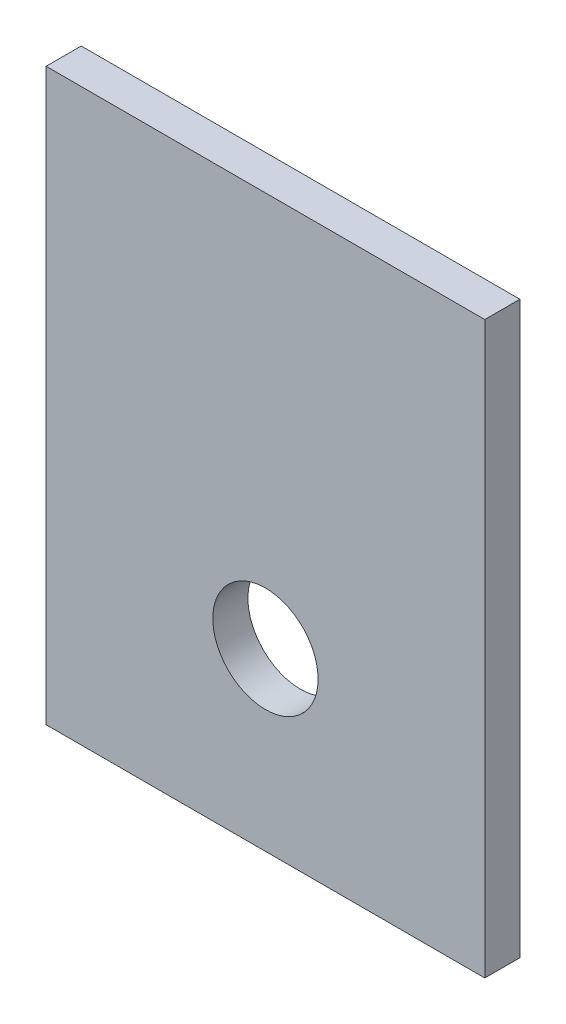
ISO-10303-21;
HEADER;
FILE_DESCRIPTION(('STEP AP214'),'2;1');
FILE_NAME('part.step','',(''),(''),'','','');
FILE_SCHEMA(('AUTOMOTIVE_DESIGN { 1 0 10303 214 1 1 1 1 }'));
ENDSEC;
DATA;
#1=APPLICATION_CONTEXT('core data for automotive mechanical design processes');
#2=APPLICATION_PROTOCOL_DEFINITION('international standard','automotive_design',2000,#1);
#3=PRODUCT_CONTEXT('',#1,'mechanical');
#4=PRODUCT('Part','Part','',(#3));
#5=PRODUCT_RELATED_PRODUCT_CATEGORY('part','',(#4));
#6=PRODUCT_DEFINITION_FORMATION('','',#4);
#7=PRODUCT_DEFINITION_CONTEXT('part definition',#1,'design');
#8=PRODUCT_DEFINITION('design','',#6,#7);
#9=PRODUCT_DEFINITION_SHAPE('','',#8);
#10=(LENGTH_UNIT() NAMED_UNIT(*) SI_UNIT(.MILLI.,.METRE.));
#11=(NAMED_UNIT(*) PLANE_ANGLE_UNIT() SI_UNIT($,.RADIAN.));
#12=(NAMED_UNIT(*) SI_UNIT($,.STERADIAN.) SOLID_ANGLE_UNIT());
#13=UNCERTAINTY_MEASURE_WITH_UNIT(LENGTH_MEASURE(1.E-05),#10,'distance_accuracy_value','');
#14=(GEOMETRIC_REPRESENTATION_CONTEXT(3) GLOBAL_UNCERTAINTY_ASSIGNED_CONTEXT((#13)) GLOBAL_UNIT_ASSIGNED_CONTEXT((#10,
#11,#12)) REPRESENTATION_CONTEXT('',''));
#15=CARTESIAN_POINT('',(0.,0.,0.));
#16=DIRECTION('',(0.,0.,1.));
#17=DIRECTION('',(1.,0.,0.));
#18=AXIS2_PLACEMENT_3D('',#15,#16,#17);
#19=CARTESIAN_POINT('',(25.,-45.,4.));
#20=DIRECTION('',(-1.,0.,0.));
#21=DIRECTION('',(0.,0.,1.));
#22=AXIS2_PLACEMENT_3D('',#19,#20,#21);
#23=PLANE('',#22);
#24=DIRECTION('',(0.,1.,0.));
#25=VECTOR('',#24,1.);
#26=CARTESIAN_POINT('',(25.,-45.,0.));
#27=LINE('',#26,#25);
#28=CARTESIAN_POINT('',(25.,-45.,0.));
#29=VERTEX_POINT('',#28);
#30=CARTESIAN_POINT('',(25.,20.,0.));
#31=VERTEX_POINT('',#30);
#32=EDGE_CURVE('E86',#29,#31,#27,.T.);
#33=ORIENTED_EDGE('',*,*,#32,.T.);
#34=DIRECTION('',(0.,0.,1.));
#35=VECTOR('',#34,1.);
#36=CARTESIAN_POINT('',(25.,20.,-6.));
#37=LINE('',#36,#35);
#38=CARTESIAN_POINT('',(25.,20.,4.));
#39=VERTEX_POINT('',#38);
#40=EDGE_CURVE('E50',#31,#39,#37,.T.);
#41=ORIENTED_EDGE('',*,*,#40,.T.);
#42=DIRECTION('',(0.,1.,0.));
#43=VECTOR('',#42,1.);
#44=CARTESIAN_POINT('',(25.,-45.,4.));
#45=LINE('',#44,#43);
#46=CARTESIAN_POINT('',(25.,-45.,4.));
#47=VERTEX_POINT('',#46);
#48=EDGE_CURVE('E81',#47,#39,#45,.T.);
#49=ORIENTED_EDGE('',*,*,#48,.F.);
#50=DIRECTION('',(0.,0.,-1.));
#51=VECTOR('',#50,1.);
#52=CARTESIAN_POINT('',(25.,-45.,4.));
#53=LINE('',#52,#51);
#54=EDGE_CURVE('E75',#47,#29,#53,.T.);
#55=ORIENTED_EDGE('',*,*,#54,.T.);
#56=EDGE_LOOP('',(#33,#41,#49,#55));
#57=FACE_BOUND('',#56,.T.);
#58=ADVANCED_FACE('F37',(#57),#23,.F.);
#59=CARTESIAN_POINT('',(-25.,-45.,4.));
#60=DIRECTION('',(1.,0.,0.));
#61=DIRECTION('',(0.,0.,-1.));
#62=AXIS2_PLACEMENT_3D('',#59,#60,#61);
#63=PLANE('',#62);
#64=DIRECTION('',(0.,-1.,0.));
#65=VECTOR('',#64,1.);
#66=CARTESIAN_POINT('',(-25.,-45.,4.));
#67=LINE('',#66,#65);
#68=CARTESIAN_POINT('',(-25.,20.,4.));
#69=VERTEX_POINT('',#68);
#70=CARTESIAN_POINT('',(-25.,-45.,4.));
#71=VERTEX_POINT('',#70);
#72=EDGE_CURVE('E98',#69,#71,#67,.T.);
#73=ORIENTED_EDGE('',*,*,#72,.F.);
#74=DIRECTION('',(0.,0.,1.));
#75=VECTOR('',#74,1.);
#76=CARTESIAN_POINT('',(-25.,20.,-6.));
#77=LINE('',#76,#75);
#78=CARTESIAN_POINT('',(-25.,20.,0.));
#79=VERTEX_POINT('',#78);
#80=EDGE_CURVE('E103',#79,#69,#77,.T.);
#81=ORIENTED_EDGE('',*,*,#80,.F.);
#82=DIRECTION('',(0.,-1.,0.));
#83=VECTOR('',#82,1.);
#84=CARTESIAN_POINT('',(-25.,-45.,0.));
#85=LINE('',#84,#83);
#86=CARTESIAN_POINT('',(-25.,-45.,0.));
#87=VERTEX_POINT('',#86);
#88=EDGE_CURVE('E82',#79,#87,#85,.T.);
#89=ORIENTED_EDGE('',*,*,#88,.T.);
#90=DIRECTION('',(0.,0.,-1.));
#91=VECTOR('',#90,1.);
#92=CARTESIAN_POINT('',(-25.,-45.,4.));
#93=LINE('',#92,#91);
#94=EDGE_CURVE('E44',#71,#87,#93,.T.);
#95=ORIENTED_EDGE('',*,*,#94,.F.);
#96=EDGE_LOOP('',(#73,#81,#89,#95));
#97=FACE_BOUND('',#96,.T.);
#98=ADVANCED_FACE('F125',(#97),#63,.F.);
#99=CARTESIAN_POINT('',(-25.,-45.,4.));
#100=DIRECTION('',(0.,1.,0.));
#101=DIRECTION('',(0.,0.,1.));
#102=AXIS2_PLACEMENT_3D('',#99,#100,#101);
#103=PLANE('',#102);
#104=DIRECTION('',(1.,0.,0.));
#105=VECTOR('',#104,1.);
#106=CARTESIAN_POINT('',(-25.,-45.,0.));
#107=LINE('',#106,#105);
#108=EDGE_CURVE('E72',#87,#29,#107,.T.);
#109=ORIENTED_EDGE('',*,*,#108,.T.);
#110=ORIENTED_EDGE('',*,*,#54,.F.);
#111=DIRECTION('',(1.,0.,0.));
#112=VECTOR('',#111,1.);
#113=CARTESIAN_POINT('',(-25.,-45.,4.));
#114=LINE('',#113,#112);
#115=EDGE_CURVE('E59',#71,#47,#114,.T.);
#116=ORIENTED_EDGE('',*,*,#115,.F.);
#117=ORIENTED_EDGE('',*,*,#94,.T.);
#118=EDGE_LOOP('',(#109,#110,#116,#117));
#119=FACE_BOUND('',#118,.T.);
#120=ADVANCED_FACE('F74',(#119),#103,.F.);
#121=CARTESIAN_POINT('',(0.,0.,4.));
#122=DIRECTION('',(0.,0.,-1.));
#123=DIRECTION('',(-1.,0.,0.));
#124=AXIS2_PLACEMENT_3D('',#121,#122,#123);
#125=PLANE('',#124);
#126=CARTESIAN_POINT('',(0.,-25.,4.));
#127=DIRECTION('',(0.,0.,1.));
#128=DIRECTION('',(1.,0.,0.));
#129=AXIS2_PLACEMENT_3D('',#126,#127,#128);
#130=CIRCLE('',#129,6.);
#131=CARTESIAN_POINT('',(6.,-25.,4.));
#132=VERTEX_POINT('',#131);
#133=EDGE_CURVE('E94',#132,#132,#130,.T.);
#134=ORIENTED_EDGE('',*,*,#133,.F.);
#135=EDGE_LOOP('',(#134));
#136=FACE_BOUND('',#135,.T.);
#137=ORIENTED_EDGE('',*,*,#48,.T.);
#138=DIRECTION('',(1.,0.,0.));
#139=VECTOR('',#138,1.);
#140=CARTESIAN_POINT('',(-25.,20.,4.));
#141=LINE('',#140,#139);
#142=EDGE_CURVE('E106',#69,#39,#141,.T.);
#143=ORIENTED_EDGE('',*,*,#142,.F.);
#144=ORIENTED_EDGE('',*,*,#72,.T.);
#145=ORIENTED_EDGE('',*,*,#115,.T.);
#146=EDGE_LOOP('',(#137,#143,#144,#145));
#147=FACE_BOUND('',#146,.T.);
#148=ADVANCED_FACE('F115',(#136,#147),#125,.F.);
#149=CARTESIAN_POINT('',(0.,0.,0.));
#150=DIRECTION('',(0.,0.,-1.));
#151=DIRECTION('',(-1.,0.,0.));
#152=AXIS2_PLACEMENT_3D('',#149,#150,#151);
#153=PLANE('',#152);
#154=DIRECTION('',(-1.,0.,0.));
#155=VECTOR('',#154,1.);
#156=CARTESIAN_POINT('',(0.,20.,0.));
#157=LINE('',#156,#155);
#158=EDGE_CURVE('E11',#31,#79,#157,.T.);
#159=ORIENTED_EDGE('',*,*,#158,.F.);
#160=ORIENTED_EDGE('',*,*,#32,.F.);
#161=ORIENTED_EDGE('',*,*,#108,.F.);
#162=ORIENTED_EDGE('',*,*,#88,.F.);
#163=EDGE_LOOP('',(#159,#160,#161,#162));
#164=FACE_BOUND('',#163,.T.);
#165=CARTESIAN_POINT('',(0.,-25.,0.));
#166=DIRECTION('',(0.,0.,1.));
#167=DIRECTION('',(1.,0.,0.));
#168=AXIS2_PLACEMENT_3D('',#165,#166,#167);
#169=CIRCLE('',#168,6.);
#170=CARTESIAN_POINT('',(6.,-25.,0.));
#171=VERTEX_POINT('',#170);
#172=EDGE_CURVE('E90',#171,#171,#169,.T.);
#173=ORIENTED_EDGE('',*,*,#172,.T.);
#174=EDGE_LOOP('',(#173));
#175=FACE_BOUND('',#174,.T.);
#176=ADVANCED_FACE('F88',(#164,#175),#153,.T.);
#177=CARTESIAN_POINT('',(0.,-25.,0.));
#178=DIRECTION('',(0.,0.,1.));
#179=DIRECTION('',(1.,0.,0.));
#180=AXIS2_PLACEMENT_3D('',#177,#178,#179);
#181=CYLINDRICAL_SURFACE('',#180,6.);
#182=ORIENTED_EDGE('',*,*,#172,.F.);
#183=EDGE_LOOP('',(#182));
#184=FACE_BOUND('',#183,.T.);
#185=ORIENTED_EDGE('',*,*,#133,.T.);
#186=EDGE_LOOP('',(#185));
#187=FACE_BOUND('',#186,.T.);
#188=ADVANCED_FACE('F123',(#184,#187),#181,.F.);
#189=CARTESIAN_POINT('',(-25.,20.,-6.));
#190=DIRECTION('',(0.,-1.,0.));
#191=DIRECTION('',(0.,0.,-1.));
#192=AXIS2_PLACEMENT_3D('',#189,#190,#191);
#193=PLANE('',#192);
#194=ORIENTED_EDGE('',*,*,#158,.T.);
#195=ORIENTED_EDGE('',*,*,#80,.T.);
#196=ORIENTED_EDGE('',*,*,#142,.T.);
#197=ORIENTED_EDGE('',*,*,#40,.F.);
#198=EDGE_LOOP('',(#194,#195,#196,#197));
#199=FACE_BOUND('',#198,.T.);
#200=ADVANCED_FACE('F110',(#199),#193,.F.);
#201=CLOSED_SHELL('',(#58,#98,#120,#148,#176,#188,#200));
#202=MANIFOLD_SOLID_BREP('B2',#201);
#203=ADVANCED_BREP_SHAPE_REPRESENTATION('',(#18,#202),#14);
#204=SHAPE_DEFINITION_REPRESENTATION(#9,#203);
ENDSEC;
END-ISO-10303-21;
